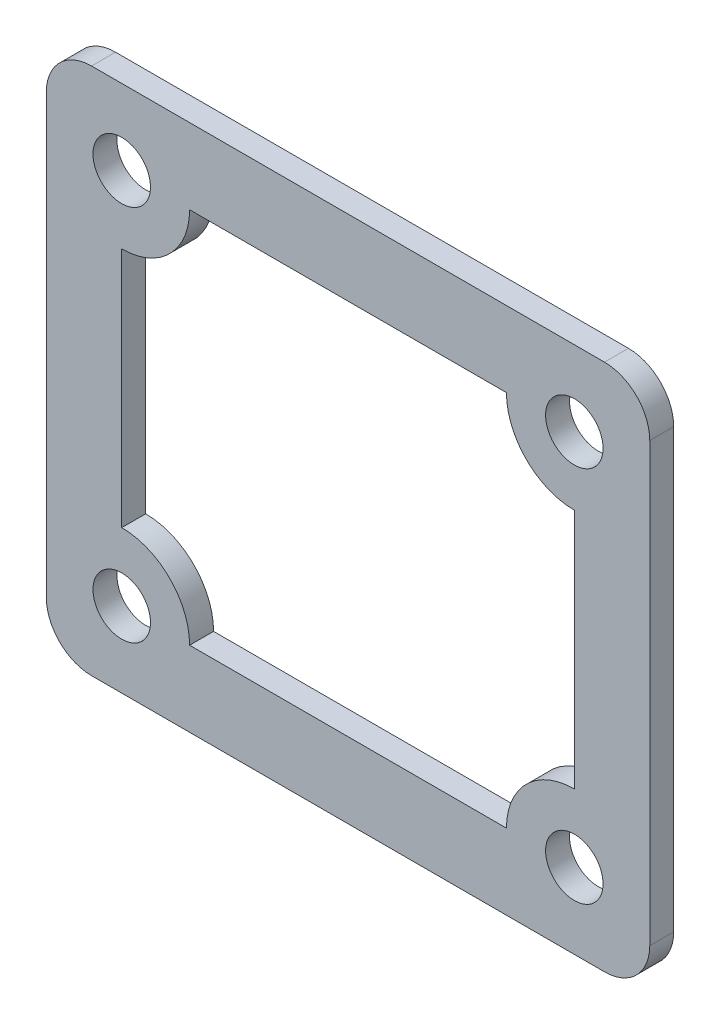
ISO-10303-21;
HEADER;
FILE_DESCRIPTION(('STEP AP214'),'2;1');
FILE_NAME('part.step','',(''),(''),'','','');
FILE_SCHEMA(('AUTOMOTIVE_DESIGN { 1 0 10303 214 1 1 1 1 }'));
ENDSEC;
DATA;
#1=APPLICATION_CONTEXT('core data for automotive mechanical design processes');
#2=APPLICATION_PROTOCOL_DEFINITION('international standard','automotive_design',2000,#1);
#3=PRODUCT_CONTEXT('',#1,'mechanical');
#4=PRODUCT('Part','Part','',(#3));
#5=PRODUCT_RELATED_PRODUCT_CATEGORY('part','',(#4));
#6=PRODUCT_DEFINITION_FORMATION('','',#4);
#7=PRODUCT_DEFINITION_CONTEXT('part definition',#1,'design');
#8=PRODUCT_DEFINITION('design','',#6,#7);
#9=PRODUCT_DEFINITION_SHAPE('','',#8);
#10=(LENGTH_UNIT() NAMED_UNIT(*) SI_UNIT(.MILLI.,.METRE.));
#11=(NAMED_UNIT(*) PLANE_ANGLE_UNIT() SI_UNIT($,.RADIAN.));
#12=(NAMED_UNIT(*) SI_UNIT($,.STERADIAN.) SOLID_ANGLE_UNIT());
#13=UNCERTAINTY_MEASURE_WITH_UNIT(LENGTH_MEASURE(1.E-05),#10,'distance_accuracy_value','');
#14=(GEOMETRIC_REPRESENTATION_CONTEXT(3) GLOBAL_UNCERTAINTY_ASSIGNED_CONTEXT((#13)) GLOBAL_UNIT_ASSIGNED_CONTEXT((#10,
#11,#12)) REPRESENTATION_CONTEXT('',''));
#15=CARTESIAN_POINT('',(0.,0.,0.));
#16=DIRECTION('',(0.,0.,1.));
#17=DIRECTION('',(1.,0.,0.));
#18=AXIS2_PLACEMENT_3D('',#15,#16,#17);
#19=CARTESIAN_POINT('',(0.,0.,1.5875));
#20=DIRECTION('',(0.,0.,1.));
#21=DIRECTION('',(1.,0.,0.));
#22=AXIS2_PLACEMENT_3D('',#19,#20,#21);
#23=PLANE('',#22);
#24=CARTESIAN_POINT('',(15.,12.5,1.5875));
#25=DIRECTION('',(0.,0.,1.));
#26=DIRECTION('',(1.,0.,0.));
#27=AXIS2_PLACEMENT_3D('',#24,#25,#26);
#28=CIRCLE('',#27,1.905);
#29=CARTESIAN_POINT('',(16.905,12.5,1.5875));
#30=VERTEX_POINT('',#29);
#31=EDGE_CURVE('E230',#30,#30,#28,.T.);
#32=ORIENTED_EDGE('',*,*,#31,.F.);
#33=EDGE_LOOP('',(#32));
#34=FACE_BOUND('',#33,.T.);
#35=CARTESIAN_POINT('',(15.,-12.5,1.5875));
#36=DIRECTION('',(0.,0.,1.));
#37=DIRECTION('',(-1.,0.,0.));
#38=AXIS2_PLACEMENT_3D('',#35,#36,#37);
#39=CIRCLE('',#38,1.905);
#40=CARTESIAN_POINT('',(13.095,-12.5,1.5875));
#41=VERTEX_POINT('',#40);
#42=EDGE_CURVE('E242',#41,#41,#39,.T.);
#43=ORIENTED_EDGE('',*,*,#42,.F.);
#44=EDGE_LOOP('',(#43));
#45=FACE_BOUND('',#44,.T.);
#46=DIRECTION('',(0.,1.,0.));
#47=VECTOR('',#46,1.);
#48=CARTESIAN_POINT('',(20.,17.5,1.5875));
#49=LINE('',#48,#47);
#50=CARTESIAN_POINT('',(20.,-14.5,1.5875));
#51=VERTEX_POINT('',#50);
#52=CARTESIAN_POINT('',(20.,14.5,1.5875));
#53=VERTEX_POINT('',#52);
#54=EDGE_CURVE('E248',#51,#53,#49,.T.);
#55=ORIENTED_EDGE('',*,*,#54,.T.);
#56=CARTESIAN_POINT('',(17.,14.5,1.5875));
#57=DIRECTION('',(0.,0.,1.));
#58=DIRECTION('',(1.,0.,0.));
#59=AXIS2_PLACEMENT_3D('',#56,#57,#58);
#60=CIRCLE('',#59,3.);
#61=CARTESIAN_POINT('',(17.,17.5,1.5875));
#62=VERTEX_POINT('',#61);
#63=EDGE_CURVE('E291',#53,#62,#60,.T.);
#64=ORIENTED_EDGE('',*,*,#63,.T.);
#65=DIRECTION('',(-1.,0.,0.));
#66=VECTOR('',#65,1.);
#67=CARTESIAN_POINT('',(-20.,17.5,1.5875));
#68=LINE('',#67,#66);
#69=CARTESIAN_POINT('',(-17.,17.5,1.5875));
#70=VERTEX_POINT('',#69);
#71=EDGE_CURVE('E251',#62,#70,#68,.T.);
#72=ORIENTED_EDGE('',*,*,#71,.T.);
#73=CARTESIAN_POINT('',(-17.,14.5,1.5875));
#74=DIRECTION('',(0.,0.,1.));
#75=DIRECTION('',(1.,0.,0.));
#76=AXIS2_PLACEMENT_3D('',#73,#74,#75);
#77=CIRCLE('',#76,3.);
#78=CARTESIAN_POINT('',(-20.,14.5,1.5875));
#79=VERTEX_POINT('',#78);
#80=EDGE_CURVE('E289',#70,#79,#77,.T.);
#81=ORIENTED_EDGE('',*,*,#80,.T.);
#82=DIRECTION('',(0.,-1.,0.));
#83=VECTOR('',#82,1.);
#84=CARTESIAN_POINT('',(-20.,17.5,1.5875));
#85=LINE('',#84,#83);
#86=CARTESIAN_POINT('',(-20.,-14.5,1.5875));
#87=VERTEX_POINT('',#86);
#88=EDGE_CURVE('E255',#79,#87,#85,.T.);
#89=ORIENTED_EDGE('',*,*,#88,.T.);
#90=CARTESIAN_POINT('',(-17.,-14.5,1.5875));
#91=DIRECTION('',(0.,0.,1.));
#92=DIRECTION('',(1.,0.,0.));
#93=AXIS2_PLACEMENT_3D('',#90,#91,#92);
#94=CIRCLE('',#93,3.);
#95=CARTESIAN_POINT('',(-17.,-17.5,1.5875));
#96=VERTEX_POINT('',#95);
#97=EDGE_CURVE('E60',#87,#96,#94,.T.);
#98=ORIENTED_EDGE('',*,*,#97,.T.);
#99=DIRECTION('',(1.,0.,0.));
#100=VECTOR('',#99,1.);
#101=CARTESIAN_POINT('',(-20.,-17.5,1.5875));
#102=LINE('',#101,#100);
#103=CARTESIAN_POINT('',(17.,-17.5,1.5875));
#104=VERTEX_POINT('',#103);
#105=EDGE_CURVE('E257',#96,#104,#102,.T.);
#106=ORIENTED_EDGE('',*,*,#105,.T.);
#107=CARTESIAN_POINT('',(17.,-14.5,1.5875));
#108=DIRECTION('',(0.,0.,1.));
#109=DIRECTION('',(1.,0.,0.));
#110=AXIS2_PLACEMENT_3D('',#107,#108,#109);
#111=CIRCLE('',#110,3.);
#112=EDGE_CURVE('E286',#104,#51,#111,.T.);
#113=ORIENTED_EDGE('',*,*,#112,.T.);
#114=EDGE_LOOP('',(#55,#64,#72,#81,#89,#98,#106,#113));
#115=FACE_BOUND('',#114,.T.);
#116=CARTESIAN_POINT('',(-15.,-12.5,1.5875));
#117=DIRECTION('',(0.,0.,1.));
#118=DIRECTION('',(1.,0.,0.));
#119=AXIS2_PLACEMENT_3D('',#116,#117,#118);
#120=CIRCLE('',#119,1.905);
#121=CARTESIAN_POINT('',(-13.095,-12.5,1.5875));
#122=VERTEX_POINT('',#121);
#123=EDGE_CURVE('E236',#122,#122,#120,.T.);
#124=ORIENTED_EDGE('',*,*,#123,.F.);
#125=EDGE_LOOP('',(#124));
#126=FACE_BOUND('',#125,.T.);
#127=CARTESIAN_POINT('',(-15.,12.5,1.5875));
#128=DIRECTION('',(0.,0.,1.));
#129=DIRECTION('',(-1.,0.,0.));
#130=AXIS2_PLACEMENT_3D('',#127,#128,#129);
#131=CIRCLE('',#130,1.905);
#132=CARTESIAN_POINT('',(-16.905,12.5,1.5875));
#133=VERTEX_POINT('',#132);
#134=EDGE_CURVE('E224',#133,#133,#131,.T.);
#135=ORIENTED_EDGE('',*,*,#134,.F.);
#136=EDGE_LOOP('',(#135));
#137=FACE_BOUND('',#136,.T.);
#138=DIRECTION('',(1.,0.,0.));
#139=VECTOR('',#138,1.);
#140=CARTESIAN_POINT('',(10.5,-12.5,1.5875));
#141=LINE('',#140,#139);
#142=CARTESIAN_POINT('',(-10.5,-12.5,1.5875));
#143=VERTEX_POINT('',#142);
#144=CARTESIAN_POINT('',(10.5,-12.5,1.5875));
#145=VERTEX_POINT('',#144);
#146=EDGE_CURVE('E164',#143,#145,#141,.T.);
#147=ORIENTED_EDGE('',*,*,#146,.F.);
#148=CARTESIAN_POINT('',(-15.,-12.5,1.5875));
#149=DIRECTION('',(0.,0.,-1.));
#150=DIRECTION('',(1.,0.,0.));
#151=AXIS2_PLACEMENT_3D('',#148,#149,#150);
#152=CIRCLE('',#151,4.5);
#153=CARTESIAN_POINT('',(-15.,-8.,1.5875));
#154=VERTEX_POINT('',#153);
#155=EDGE_CURVE('E154',#154,#143,#152,.T.);
#156=ORIENTED_EDGE('',*,*,#155,.F.);
#157=DIRECTION('',(0.,-1.,0.));
#158=VECTOR('',#157,1.);
#159=CARTESIAN_POINT('',(-15.,7.99999999999999,1.5875));
#160=LINE('',#159,#158);
#161=CARTESIAN_POINT('',(-15.,8.,1.5875));
#162=VERTEX_POINT('',#161);
#163=EDGE_CURVE('E190',#162,#154,#160,.T.);
#164=ORIENTED_EDGE('',*,*,#163,.F.);
#165=CARTESIAN_POINT('',(-15.,12.5,1.5875));
#166=DIRECTION('',(0.,0.,-1.));
#167=DIRECTION('',(-1.,0.,0.));
#168=AXIS2_PLACEMENT_3D('',#165,#166,#167);
#169=CIRCLE('',#168,4.5);
#170=CARTESIAN_POINT('',(-10.5,12.5,1.5875));
#171=VERTEX_POINT('',#170);
#172=EDGE_CURVE('E187',#171,#162,#169,.T.);
#173=ORIENTED_EDGE('',*,*,#172,.F.);
#174=DIRECTION('',(-1.,0.,0.));
#175=VECTOR('',#174,1.);
#176=CARTESIAN_POINT('',(10.5,12.5,1.5875));
#177=LINE('',#176,#175);
#178=CARTESIAN_POINT('',(10.5,12.5,1.5875));
#179=VERTEX_POINT('',#178);
#180=EDGE_CURVE('E185',#179,#171,#177,.T.);
#181=ORIENTED_EDGE('',*,*,#180,.F.);
#182=CARTESIAN_POINT('',(15.,12.5,1.5875));
#183=DIRECTION('',(0.,0.,-1.));
#184=DIRECTION('',(1.,0.,0.));
#185=AXIS2_PLACEMENT_3D('',#182,#183,#184);
#186=CIRCLE('',#185,4.5);
#187=CARTESIAN_POINT('',(15.,8.,1.5875));
#188=VERTEX_POINT('',#187);
#189=EDGE_CURVE('E183',#188,#179,#186,.T.);
#190=ORIENTED_EDGE('',*,*,#189,.F.);
#191=DIRECTION('',(0.,1.,0.));
#192=VECTOR('',#191,1.);
#193=CARTESIAN_POINT('',(15.,8.,1.5875));
#194=LINE('',#193,#192);
#195=CARTESIAN_POINT('',(15.,-8.00000000000001,1.5875));
#196=VERTEX_POINT('',#195);
#197=EDGE_CURVE('E179',#196,#188,#194,.T.);
#198=ORIENTED_EDGE('',*,*,#197,.F.);
#199=CARTESIAN_POINT('',(15.,-12.5,1.5875));
#200=DIRECTION('',(0.,0.,-1.));
#201=DIRECTION('',(-1.,0.,0.));
#202=AXIS2_PLACEMENT_3D('',#199,#200,#201);
#203=CIRCLE('',#202,4.5);
#204=EDGE_CURVE('E177',#145,#196,#203,.T.);
#205=ORIENTED_EDGE('',*,*,#204,.F.);
#206=EDGE_LOOP('',(#147,#156,#164,#173,#181,#190,#198,#205));
#207=FACE_BOUND('',#206,.T.);
#208=ADVANCED_FACE('F39',(#34,#45,#115,#126,#137,#207),#23,.T.);
#209=CARTESIAN_POINT('',(0.,0.,0.));
#210=DIRECTION('',(0.,0.,1.));
#211=DIRECTION('',(1.,0.,0.));
#212=AXIS2_PLACEMENT_3D('',#209,#210,#211);
#213=PLANE('',#212);
#214=CARTESIAN_POINT('',(-15.,12.5,0.));
#215=DIRECTION('',(0.,0.,1.));
#216=DIRECTION('',(-1.,0.,0.));
#217=AXIS2_PLACEMENT_3D('',#214,#215,#216);
#218=CIRCLE('',#217,1.905);
#219=CARTESIAN_POINT('',(-16.905,12.5,0.));
#220=VERTEX_POINT('',#219);
#221=EDGE_CURVE('E172',#220,#220,#218,.T.);
#222=ORIENTED_EDGE('',*,*,#221,.T.);
#223=EDGE_LOOP('',(#222));
#224=FACE_BOUND('',#223,.T.);
#225=CARTESIAN_POINT('',(15.,12.5,0.));
#226=DIRECTION('',(0.,0.,1.));
#227=DIRECTION('',(1.,0.,0.));
#228=AXIS2_PLACEMENT_3D('',#225,#226,#227);
#229=CIRCLE('',#228,1.905);
#230=CARTESIAN_POINT('',(16.905,12.5,0.));
#231=VERTEX_POINT('',#230);
#232=EDGE_CURVE('E227',#231,#231,#229,.T.);
#233=ORIENTED_EDGE('',*,*,#232,.T.);
#234=EDGE_LOOP('',(#233));
#235=FACE_BOUND('',#234,.T.);
#236=CARTESIAN_POINT('',(-15.,-12.5,0.));
#237=DIRECTION('',(0.,0.,1.));
#238=DIRECTION('',(1.,0.,0.));
#239=AXIS2_PLACEMENT_3D('',#236,#237,#238);
#240=CIRCLE('',#239,1.905);
#241=CARTESIAN_POINT('',(-13.095,-12.5,0.));
#242=VERTEX_POINT('',#241);
#243=EDGE_CURVE('E233',#242,#242,#240,.T.);
#244=ORIENTED_EDGE('',*,*,#243,.T.);
#245=EDGE_LOOP('',(#244));
#246=FACE_BOUND('',#245,.T.);
#247=CARTESIAN_POINT('',(15.,-12.5,0.));
#248=DIRECTION('',(0.,0.,1.));
#249=DIRECTION('',(-1.,0.,0.));
#250=AXIS2_PLACEMENT_3D('',#247,#248,#249);
#251=CIRCLE('',#250,1.905);
#252=CARTESIAN_POINT('',(13.095,-12.5,0.));
#253=VERTEX_POINT('',#252);
#254=EDGE_CURVE('E239',#253,#253,#251,.T.);
#255=ORIENTED_EDGE('',*,*,#254,.T.);
#256=EDGE_LOOP('',(#255));
#257=FACE_BOUND('',#256,.T.);
#258=DIRECTION('',(-1.,0.,0.));
#259=VECTOR('',#258,1.);
#260=CARTESIAN_POINT('',(-20.,17.5,0.));
#261=LINE('',#260,#259);
#262=CARTESIAN_POINT('',(17.,17.5,0.));
#263=VERTEX_POINT('',#262);
#264=CARTESIAN_POINT('',(-17.,17.5,0.));
#265=VERTEX_POINT('',#264);
#266=EDGE_CURVE('E262',#263,#265,#261,.T.);
#267=ORIENTED_EDGE('',*,*,#266,.F.);
#268=CARTESIAN_POINT('',(17.,14.5,0.));
#269=DIRECTION('',(0.,0.,1.));
#270=DIRECTION('',(1.,0.,0.));
#271=AXIS2_PLACEMENT_3D('',#268,#269,#270);
#272=CIRCLE('',#271,3.);
#273=CARTESIAN_POINT('',(20.,14.5,0.));
#274=VERTEX_POINT('',#273);
#275=EDGE_CURVE('E279',#263,#274,#272,.F.);
#276=ORIENTED_EDGE('',*,*,#275,.T.);
#277=DIRECTION('',(0.,1.,0.));
#278=VECTOR('',#277,1.);
#279=CARTESIAN_POINT('',(20.,17.5,0.));
#280=LINE('',#279,#278);
#281=CARTESIAN_POINT('',(20.,-14.5,0.));
#282=VERTEX_POINT('',#281);
#283=EDGE_CURVE('E245',#282,#274,#280,.T.);
#284=ORIENTED_EDGE('',*,*,#283,.F.);
#285=CARTESIAN_POINT('',(17.,-14.5,0.));
#286=DIRECTION('',(0.,0.,1.));
#287=DIRECTION('',(1.,0.,0.));
#288=AXIS2_PLACEMENT_3D('',#285,#286,#287);
#289=CIRCLE('',#288,3.);
#290=CARTESIAN_POINT('',(17.,-17.5,0.));
#291=VERTEX_POINT('',#290);
#292=EDGE_CURVE('E273',#282,#291,#289,.F.);
#293=ORIENTED_EDGE('',*,*,#292,.T.);
#294=DIRECTION('',(1.,0.,0.));
#295=VECTOR('',#294,1.);
#296=CARTESIAN_POINT('',(-20.,-17.5,0.));
#297=LINE('',#296,#295);
#298=CARTESIAN_POINT('',(-17.,-17.5,0.));
#299=VERTEX_POINT('',#298);
#300=EDGE_CURVE('E252',#299,#291,#297,.T.);
#301=ORIENTED_EDGE('',*,*,#300,.F.);
#302=CARTESIAN_POINT('',(-17.,-14.5,0.));
#303=DIRECTION('',(0.,0.,1.));
#304=DIRECTION('',(1.,0.,0.));
#305=AXIS2_PLACEMENT_3D('',#302,#303,#304);
#306=CIRCLE('',#305,3.);
#307=CARTESIAN_POINT('',(-20.,-14.5,0.));
#308=VERTEX_POINT('',#307);
#309=EDGE_CURVE('E275',#299,#308,#306,.F.);
#310=ORIENTED_EDGE('',*,*,#309,.T.);
#311=DIRECTION('',(0.,-1.,0.));
#312=VECTOR('',#311,1.);
#313=CARTESIAN_POINT('',(-20.,17.5,0.));
#314=LINE('',#313,#312);
#315=CARTESIAN_POINT('',(-20.,14.5,0.));
#316=VERTEX_POINT('',#315);
#317=EDGE_CURVE('E265',#316,#308,#314,.T.);
#318=ORIENTED_EDGE('',*,*,#317,.F.);
#319=CARTESIAN_POINT('',(-17.,14.5,0.));
#320=DIRECTION('',(0.,0.,1.));
#321=DIRECTION('',(1.,0.,0.));
#322=AXIS2_PLACEMENT_3D('',#319,#320,#321);
#323=CIRCLE('',#322,3.);
#324=EDGE_CURVE('E277',#316,#265,#323,.F.);
#325=ORIENTED_EDGE('',*,*,#324,.T.);
#326=EDGE_LOOP('',(#267,#276,#284,#293,#301,#310,#318,#325));
#327=FACE_BOUND('',#326,.T.);
#328=CARTESIAN_POINT('',(-15.,-12.5,0.));
#329=DIRECTION('',(0.,0.,-1.));
#330=DIRECTION('',(1.,0.,0.));
#331=AXIS2_PLACEMENT_3D('',#328,#329,#330);
#332=CIRCLE('',#331,4.5);
#333=CARTESIAN_POINT('',(-15.,-8.,0.));
#334=VERTEX_POINT('',#333);
#335=CARTESIAN_POINT('',(-10.5,-12.5,0.));
#336=VERTEX_POINT('',#335);
#337=EDGE_CURVE('E192',#334,#336,#332,.T.);
#338=ORIENTED_EDGE('',*,*,#337,.T.);
#339=DIRECTION('',(1.,0.,0.));
#340=VECTOR('',#339,1.);
#341=CARTESIAN_POINT('',(10.5,-12.5,0.));
#342=LINE('',#341,#340);
#343=CARTESIAN_POINT('',(10.5,-12.5,0.));
#344=VERTEX_POINT('',#343);
#345=EDGE_CURVE('E171',#336,#344,#342,.T.);
#346=ORIENTED_EDGE('',*,*,#345,.T.);
#347=CARTESIAN_POINT('',(15.,-12.5,0.));
#348=DIRECTION('',(0.,0.,-1.));
#349=DIRECTION('',(-1.,0.,0.));
#350=AXIS2_PLACEMENT_3D('',#347,#348,#349);
#351=CIRCLE('',#350,4.5);
#352=CARTESIAN_POINT('',(15.,-8.00000000000001,0.));
#353=VERTEX_POINT('',#352);
#354=EDGE_CURVE('E195',#344,#353,#351,.T.);
#355=ORIENTED_EDGE('',*,*,#354,.T.);
#356=DIRECTION('',(0.,1.,0.));
#357=VECTOR('',#356,1.);
#358=CARTESIAN_POINT('',(15.,8.,0.));
#359=LINE('',#358,#357);
#360=CARTESIAN_POINT('',(15.,8.,0.));
#361=VERTEX_POINT('',#360);
#362=EDGE_CURVE('E198',#353,#361,#359,.T.);
#363=ORIENTED_EDGE('',*,*,#362,.T.);
#364=CARTESIAN_POINT('',(15.,12.5,0.));
#365=DIRECTION('',(0.,0.,-1.));
#366=DIRECTION('',(1.,0.,0.));
#367=AXIS2_PLACEMENT_3D('',#364,#365,#366);
#368=CIRCLE('',#367,4.5);
#369=CARTESIAN_POINT('',(10.5,12.5,0.));
#370=VERTEX_POINT('',#369);
#371=EDGE_CURVE('E201',#361,#370,#368,.T.);
#372=ORIENTED_EDGE('',*,*,#371,.T.);
#373=DIRECTION('',(-1.,0.,0.));
#374=VECTOR('',#373,1.);
#375=CARTESIAN_POINT('',(10.5,12.5,0.));
#376=LINE('',#375,#374);
#377=CARTESIAN_POINT('',(-10.5,12.5,0.));
#378=VERTEX_POINT('',#377);
#379=EDGE_CURVE('E204',#370,#378,#376,.T.);
#380=ORIENTED_EDGE('',*,*,#379,.T.);
#381=CARTESIAN_POINT('',(-15.,12.5,0.));
#382=DIRECTION('',(0.,0.,-1.));
#383=DIRECTION('',(-1.,0.,0.));
#384=AXIS2_PLACEMENT_3D('',#381,#382,#383);
#385=CIRCLE('',#384,4.5);
#386=CARTESIAN_POINT('',(-15.,8.,0.));
#387=VERTEX_POINT('',#386);
#388=EDGE_CURVE('E207',#378,#387,#385,.T.);
#389=ORIENTED_EDGE('',*,*,#388,.T.);
#390=DIRECTION('',(0.,-1.,0.));
#391=VECTOR('',#390,1.);
#392=CARTESIAN_POINT('',(-15.,7.99999999999999,0.));
#393=LINE('',#392,#391);
#394=EDGE_CURVE('E165',#387,#334,#393,.T.);
#395=ORIENTED_EDGE('',*,*,#394,.T.);
#396=EDGE_LOOP('',(#338,#346,#355,#363,#372,#380,#389,#395));
#397=FACE_BOUND('',#396,.T.);
#398=ADVANCED_FACE('F307',(#224,#235,#246,#257,#327,#397),#213,.F.);
#399=CARTESIAN_POINT('',(20.,17.5,1.5875));
#400=DIRECTION('',(-1.,0.,0.));
#401=DIRECTION('',(0.,0.,1.));
#402=AXIS2_PLACEMENT_3D('',#399,#400,#401);
#403=PLANE('',#402);
#404=ORIENTED_EDGE('',*,*,#283,.T.);
#405=DIRECTION('',(0.,0.,-1.));
#406=VECTOR('',#405,1.);
#407=CARTESIAN_POINT('',(20.,14.5,1.5875));
#408=LINE('',#407,#406);
#409=EDGE_CURVE('E284',#274,#53,#408,.F.);
#410=ORIENTED_EDGE('',*,*,#409,.T.);
#411=ORIENTED_EDGE('',*,*,#54,.F.);
#412=DIRECTION('',(0.,0.,-1.));
#413=VECTOR('',#412,1.);
#414=CARTESIAN_POINT('',(20.,-14.5,1.5875));
#415=LINE('',#414,#413);
#416=EDGE_CURVE('E281',#51,#282,#415,.T.);
#417=ORIENTED_EDGE('',*,*,#416,.T.);
#418=EDGE_LOOP('',(#404,#410,#411,#417));
#419=FACE_BOUND('',#418,.T.);
#420=ADVANCED_FACE('F321',(#419),#403,.F.);
#421=CARTESIAN_POINT('',(-20.,17.5,1.5875));
#422=DIRECTION('',(0.,-1.,0.));
#423=DIRECTION('',(0.,0.,-1.));
#424=AXIS2_PLACEMENT_3D('',#421,#422,#423);
#425=PLANE('',#424);
#426=ORIENTED_EDGE('',*,*,#71,.F.);
#427=DIRECTION('',(0.,0.,-1.));
#428=VECTOR('',#427,1.);
#429=CARTESIAN_POINT('',(17.,17.5,1.5875));
#430=LINE('',#429,#428);
#431=EDGE_CURVE('E270',#62,#263,#430,.T.);
#432=ORIENTED_EDGE('',*,*,#431,.T.);
#433=ORIENTED_EDGE('',*,*,#266,.T.);
#434=DIRECTION('',(0.,0.,-1.));
#435=VECTOR('',#434,1.);
#436=CARTESIAN_POINT('',(-17.,17.5,1.5875));
#437=LINE('',#436,#435);
#438=EDGE_CURVE('E259',#265,#70,#437,.F.);
#439=ORIENTED_EDGE('',*,*,#438,.T.);
#440=EDGE_LOOP('',(#426,#432,#433,#439));
#441=FACE_BOUND('',#440,.T.);
#442=ADVANCED_FACE('F329',(#441),#425,.F.);
#443=CARTESIAN_POINT('',(-20.,17.5,1.5875));
#444=DIRECTION('',(1.,0.,0.));
#445=DIRECTION('',(0.,1.,0.));
#446=AXIS2_PLACEMENT_3D('',#443,#444,#445);
#447=PLANE('',#446);
#448=ORIENTED_EDGE('',*,*,#88,.F.);
#449=DIRECTION('',(0.,0.,-1.));
#450=VECTOR('',#449,1.);
#451=CARTESIAN_POINT('',(-20.,14.5,1.5875));
#452=LINE('',#451,#450);
#453=EDGE_CURVE('E295',#79,#316,#452,.T.);
#454=ORIENTED_EDGE('',*,*,#453,.T.);
#455=ORIENTED_EDGE('',*,*,#317,.T.);
#456=DIRECTION('',(0.,0.,-1.));
#457=VECTOR('',#456,1.);
#458=CARTESIAN_POINT('',(-20.,-14.5,1.5875));
#459=LINE('',#458,#457);
#460=EDGE_CURVE('E293',#308,#87,#459,.F.);
#461=ORIENTED_EDGE('',*,*,#460,.T.);
#462=EDGE_LOOP('',(#448,#454,#455,#461));
#463=FACE_BOUND('',#462,.T.);
#464=ADVANCED_FACE('F301',(#463),#447,.F.);
#465=CARTESIAN_POINT('',(-20.,-17.5,1.5875));
#466=DIRECTION('',(0.,1.,0.));
#467=DIRECTION('',(0.,0.,1.));
#468=AXIS2_PLACEMENT_3D('',#465,#466,#467);
#469=PLANE('',#468);
#470=ORIENTED_EDGE('',*,*,#105,.F.);
#471=DIRECTION('',(0.,0.,-1.));
#472=VECTOR('',#471,1.);
#473=CARTESIAN_POINT('',(-17.,-17.5,1.5875));
#474=LINE('',#473,#472);
#475=EDGE_CURVE('E11',#96,#299,#474,.T.);
#476=ORIENTED_EDGE('',*,*,#475,.T.);
#477=ORIENTED_EDGE('',*,*,#300,.T.);
#478=DIRECTION('',(0.,0.,-1.));
#479=VECTOR('',#478,1.);
#480=CARTESIAN_POINT('',(17.,-17.5,1.5875));
#481=LINE('',#480,#479);
#482=EDGE_CURVE('E47',#291,#104,#481,.F.);
#483=ORIENTED_EDGE('',*,*,#482,.T.);
#484=EDGE_LOOP('',(#470,#476,#477,#483));
#485=FACE_BOUND('',#484,.T.);
#486=ADVANCED_FACE('F313',(#485),#469,.F.);
#487=CARTESIAN_POINT('',(15.,-12.5,1.5875));
#488=DIRECTION('',(0.,0.,-1.));
#489=DIRECTION('',(-1.,0.,0.));
#490=AXIS2_PLACEMENT_3D('',#487,#488,#489);
#491=CYLINDRICAL_SURFACE('',#490,1.905);
#492=ORIENTED_EDGE('',*,*,#42,.T.);
#493=EDGE_LOOP('',(#492));
#494=FACE_BOUND('',#493,.T.);
#495=ORIENTED_EDGE('',*,*,#254,.F.);
#496=EDGE_LOOP('',(#495));
#497=FACE_BOUND('',#496,.T.);
#498=ADVANCED_FACE('F352',(#494,#497),#491,.F.);
#499=CARTESIAN_POINT('',(-15.,-12.5,1.5875));
#500=DIRECTION('',(0.,0.,-1.));
#501=DIRECTION('',(-1.,0.,0.));
#502=AXIS2_PLACEMENT_3D('',#499,#500,#501);
#503=CYLINDRICAL_SURFACE('',#502,1.905);
#504=ORIENTED_EDGE('',*,*,#123,.T.);
#505=EDGE_LOOP('',(#504));
#506=FACE_BOUND('',#505,.T.);
#507=ORIENTED_EDGE('',*,*,#243,.F.);
#508=EDGE_LOOP('',(#507));
#509=FACE_BOUND('',#508,.T.);
#510=ADVANCED_FACE('F468',(#506,#509),#503,.F.);
#511=CARTESIAN_POINT('',(15.,12.5,1.5875));
#512=DIRECTION('',(0.,0.,-1.));
#513=DIRECTION('',(-1.,0.,0.));
#514=AXIS2_PLACEMENT_3D('',#511,#512,#513);
#515=CYLINDRICAL_SURFACE('',#514,1.905);
#516=ORIENTED_EDGE('',*,*,#31,.T.);
#517=EDGE_LOOP('',(#516));
#518=FACE_BOUND('',#517,.T.);
#519=ORIENTED_EDGE('',*,*,#232,.F.);
#520=EDGE_LOOP('',(#519));
#521=FACE_BOUND('',#520,.T.);
#522=ADVANCED_FACE('F460',(#518,#521),#515,.F.);
#523=CARTESIAN_POINT('',(-15.,12.5,1.5875));
#524=DIRECTION('',(0.,0.,-1.));
#525=DIRECTION('',(-1.,0.,0.));
#526=AXIS2_PLACEMENT_3D('',#523,#524,#525);
#527=CYLINDRICAL_SURFACE('',#526,1.905);
#528=ORIENTED_EDGE('',*,*,#134,.T.);
#529=EDGE_LOOP('',(#528));
#530=FACE_BOUND('',#529,.T.);
#531=ORIENTED_EDGE('',*,*,#221,.F.);
#532=EDGE_LOOP('',(#531));
#533=FACE_BOUND('',#532,.T.);
#534=ADVANCED_FACE('F453',(#530,#533),#527,.F.);
#535=CARTESIAN_POINT('',(-15.,-12.5,1.5875));
#536=DIRECTION('',(0.,0.,-1.));
#537=DIRECTION('',(-1.,0.,0.));
#538=AXIS2_PLACEMENT_3D('',#535,#536,#537);
#539=CYLINDRICAL_SURFACE('',#538,4.5);
#540=ORIENTED_EDGE('',*,*,#337,.F.);
#541=DIRECTION('',(0.,0.,-1.));
#542=VECTOR('',#541,1.);
#543=CARTESIAN_POINT('',(-15.,-8.,1.5875));
#544=LINE('',#543,#542);
#545=EDGE_CURVE('E160',#154,#334,#544,.T.);
#546=ORIENTED_EDGE('',*,*,#545,.F.);
#547=ORIENTED_EDGE('',*,*,#155,.T.);
#548=DIRECTION('',(0.,0.,-1.));
#549=VECTOR('',#548,1.);
#550=CARTESIAN_POINT('',(-10.5,-12.5,1.5875));
#551=LINE('',#550,#549);
#552=EDGE_CURVE('E157',#143,#336,#551,.T.);
#553=ORIENTED_EDGE('',*,*,#552,.T.);
#554=EDGE_LOOP('',(#540,#546,#547,#553));
#555=FACE_BOUND('',#554,.T.);
#556=ADVANCED_FACE('F156',(#555),#539,.T.);
#557=CARTESIAN_POINT('',(10.5,-12.5,1.5875));
#558=DIRECTION('',(0.,1.,0.));
#559=DIRECTION('',(-1.,0.,0.));
#560=AXIS2_PLACEMENT_3D('',#557,#558,#559);
#561=PLANE('',#560);
#562=ORIENTED_EDGE('',*,*,#345,.F.);
#563=ORIENTED_EDGE('',*,*,#552,.F.);
#564=ORIENTED_EDGE('',*,*,#146,.T.);
#565=DIRECTION('',(0.,0.,-1.));
#566=VECTOR('',#565,1.);
#567=CARTESIAN_POINT('',(10.5,-12.5,1.5875));
#568=LINE('',#567,#566);
#569=EDGE_CURVE('E173',#145,#344,#568,.T.);
#570=ORIENTED_EDGE('',*,*,#569,.T.);
#571=EDGE_LOOP('',(#562,#563,#564,#570));
#572=FACE_BOUND('',#571,.T.);
#573=ADVANCED_FACE('F168',(#572),#561,.T.);
#574=CARTESIAN_POINT('',(15.,-12.5,1.5875));
#575=DIRECTION('',(0.,0.,-1.));
#576=DIRECTION('',(-1.,0.,0.));
#577=AXIS2_PLACEMENT_3D('',#574,#575,#576);
#578=CYLINDRICAL_SURFACE('',#577,4.5);
#579=ORIENTED_EDGE('',*,*,#354,.F.);
#580=ORIENTED_EDGE('',*,*,#569,.F.);
#581=ORIENTED_EDGE('',*,*,#204,.T.);
#582=DIRECTION('',(0.,0.,-1.));
#583=VECTOR('',#582,1.);
#584=CARTESIAN_POINT('',(15.,-8.00000000000001,1.5875));
#585=LINE('',#584,#583);
#586=EDGE_CURVE('E221',#196,#353,#585,.T.);
#587=ORIENTED_EDGE('',*,*,#586,.T.);
#588=EDGE_LOOP('',(#579,#580,#581,#587));
#589=FACE_BOUND('',#588,.T.);
#590=ADVANCED_FACE('F432',(#589),#578,.T.);
#591=CARTESIAN_POINT('',(15.,8.,1.5875));
#592=DIRECTION('',(-1.,0.,0.));
#593=DIRECTION('',(0.,-1.,0.));
#594=AXIS2_PLACEMENT_3D('',#591,#592,#593);
#595=PLANE('',#594);
#596=ORIENTED_EDGE('',*,*,#362,.F.);
#597=ORIENTED_EDGE('',*,*,#586,.F.);
#598=ORIENTED_EDGE('',*,*,#197,.T.);
#599=DIRECTION('',(0.,0.,-1.));
#600=VECTOR('',#599,1.);
#601=CARTESIAN_POINT('',(15.,8.,1.5875));
#602=LINE('',#601,#600);
#603=EDGE_CURVE('E219',#188,#361,#602,.T.);
#604=ORIENTED_EDGE('',*,*,#603,.T.);
#605=EDGE_LOOP('',(#596,#597,#598,#604));
#606=FACE_BOUND('',#605,.T.);
#607=ADVANCED_FACE('F424',(#606),#595,.T.);
#608=CARTESIAN_POINT('',(15.,12.5,1.5875));
#609=DIRECTION('',(0.,0.,-1.));
#610=DIRECTION('',(-1.,0.,0.));
#611=AXIS2_PLACEMENT_3D('',#608,#609,#610);
#612=CYLINDRICAL_SURFACE('',#611,4.5);
#613=ORIENTED_EDGE('',*,*,#371,.F.);
#614=ORIENTED_EDGE('',*,*,#603,.F.);
#615=ORIENTED_EDGE('',*,*,#189,.T.);
#616=DIRECTION('',(0.,0.,-1.));
#617=VECTOR('',#616,1.);
#618=CARTESIAN_POINT('',(10.5,12.5,1.5875));
#619=LINE('',#618,#617);
#620=EDGE_CURVE('E217',#179,#370,#619,.T.);
#621=ORIENTED_EDGE('',*,*,#620,.T.);
#622=EDGE_LOOP('',(#613,#614,#615,#621));
#623=FACE_BOUND('',#622,.T.);
#624=ADVANCED_FACE('F416',(#623),#612,.T.);
#625=CARTESIAN_POINT('',(10.5,12.5,1.5875));
#626=DIRECTION('',(0.,-1.,0.));
#627=DIRECTION('',(1.,0.,0.));
#628=AXIS2_PLACEMENT_3D('',#625,#626,#627);
#629=PLANE('',#628);
#630=ORIENTED_EDGE('',*,*,#379,.F.);
#631=ORIENTED_EDGE('',*,*,#620,.F.);
#632=ORIENTED_EDGE('',*,*,#180,.T.);
#633=DIRECTION('',(0.,0.,-1.));
#634=VECTOR('',#633,1.);
#635=CARTESIAN_POINT('',(-10.5,12.5,1.5875));
#636=LINE('',#635,#634);
#637=EDGE_CURVE('E215',#171,#378,#636,.T.);
#638=ORIENTED_EDGE('',*,*,#637,.T.);
#639=EDGE_LOOP('',(#630,#631,#632,#638));
#640=FACE_BOUND('',#639,.T.);
#641=ADVANCED_FACE('F408',(#640),#629,.T.);
#642=CARTESIAN_POINT('',(-15.,12.5,1.5875));
#643=DIRECTION('',(0.,0.,-1.));
#644=DIRECTION('',(-1.,0.,0.));
#645=AXIS2_PLACEMENT_3D('',#642,#643,#644);
#646=CYLINDRICAL_SURFACE('',#645,4.5);
#647=ORIENTED_EDGE('',*,*,#388,.F.);
#648=ORIENTED_EDGE('',*,*,#637,.F.);
#649=ORIENTED_EDGE('',*,*,#172,.T.);
#650=DIRECTION('',(0.,0.,-1.));
#651=VECTOR('',#650,1.);
#652=CARTESIAN_POINT('',(-15.,8.,1.5875));
#653=LINE('',#652,#651);
#654=EDGE_CURVE('E213',#162,#387,#653,.T.);
#655=ORIENTED_EDGE('',*,*,#654,.T.);
#656=EDGE_LOOP('',(#647,#648,#649,#655));
#657=FACE_BOUND('',#656,.T.);
#658=ADVANCED_FACE('F400',(#657),#646,.T.);
#659=CARTESIAN_POINT('',(-15.,7.99999999999999,1.5875));
#660=DIRECTION('',(1.,0.,0.));
#661=DIRECTION('',(0.,1.,0.));
#662=AXIS2_PLACEMENT_3D('',#659,#660,#661);
#663=PLANE('',#662);
#664=ORIENTED_EDGE('',*,*,#394,.F.);
#665=ORIENTED_EDGE('',*,*,#654,.F.);
#666=ORIENTED_EDGE('',*,*,#163,.T.);
#667=ORIENTED_EDGE('',*,*,#545,.T.);
#668=EDGE_LOOP('',(#664,#665,#666,#667));
#669=FACE_BOUND('',#668,.T.);
#670=ADVANCED_FACE('F338',(#669),#663,.T.);
#671=CARTESIAN_POINT('',(17.,14.5,1.5875));
#672=DIRECTION('',(0.,0.,-1.));
#673=DIRECTION('',(-1.,0.,0.));
#674=AXIS2_PLACEMENT_3D('',#671,#672,#673);
#675=CYLINDRICAL_SURFACE('',#674,3.);
#676=ORIENTED_EDGE('',*,*,#63,.F.);
#677=ORIENTED_EDGE('',*,*,#409,.F.);
#678=ORIENTED_EDGE('',*,*,#275,.F.);
#679=ORIENTED_EDGE('',*,*,#431,.F.);
#680=EDGE_LOOP('',(#676,#677,#678,#679));
#681=FACE_BOUND('',#680,.T.);
#682=ADVANCED_FACE('F326',(#681),#675,.T.);
#683=CARTESIAN_POINT('',(-17.,14.5,1.5875));
#684=DIRECTION('',(0.,0.,-1.));
#685=DIRECTION('',(-1.,0.,0.));
#686=AXIS2_PLACEMENT_3D('',#683,#684,#685);
#687=CYLINDRICAL_SURFACE('',#686,3.);
#688=ORIENTED_EDGE('',*,*,#80,.F.);
#689=ORIENTED_EDGE('',*,*,#438,.F.);
#690=ORIENTED_EDGE('',*,*,#324,.F.);
#691=ORIENTED_EDGE('',*,*,#453,.F.);
#692=EDGE_LOOP('',(#688,#689,#690,#691));
#693=FACE_BOUND('',#692,.T.);
#694=ADVANCED_FACE('F331',(#693),#687,.T.);
#695=CARTESIAN_POINT('',(-17.,-14.5,1.5875));
#696=DIRECTION('',(0.,0.,-1.));
#697=DIRECTION('',(-1.,0.,0.));
#698=AXIS2_PLACEMENT_3D('',#695,#696,#697);
#699=CYLINDRICAL_SURFACE('',#698,3.);
#700=ORIENTED_EDGE('',*,*,#97,.F.);
#701=ORIENTED_EDGE('',*,*,#460,.F.);
#702=ORIENTED_EDGE('',*,*,#309,.F.);
#703=ORIENTED_EDGE('',*,*,#475,.F.);
#704=EDGE_LOOP('',(#700,#701,#702,#703));
#705=FACE_BOUND('',#704,.T.);
#706=ADVANCED_FACE('F312',(#705),#699,.T.);
#707=CARTESIAN_POINT('',(17.,-14.5,1.5875));
#708=DIRECTION('',(0.,0.,-1.));
#709=DIRECTION('',(-1.,0.,0.));
#710=AXIS2_PLACEMENT_3D('',#707,#708,#709);
#711=CYLINDRICAL_SURFACE('',#710,3.);
#712=ORIENTED_EDGE('',*,*,#112,.F.);
#713=ORIENTED_EDGE('',*,*,#482,.F.);
#714=ORIENTED_EDGE('',*,*,#292,.F.);
#715=ORIENTED_EDGE('',*,*,#416,.F.);
#716=EDGE_LOOP('',(#712,#713,#714,#715));
#717=FACE_BOUND('',#716,.T.);
#718=ADVANCED_FACE('F41',(#717),#711,.T.);
#719=CLOSED_SHELL('',(#208,#398,#420,#442,#464,#486,#498,#510,#522,#534,#556,#573,#590,#607,
#624,#641,#658,#670,#682,#694,#706,#718));
#720=MANIFOLD_SOLID_BREP('B2',#719);
#721=ADVANCED_BREP_SHAPE_REPRESENTATION('',(#18,#720),#14);
#722=SHAPE_DEFINITION_REPRESENTATION(#9,#721);
ENDSEC;
END-ISO-10303-21;
